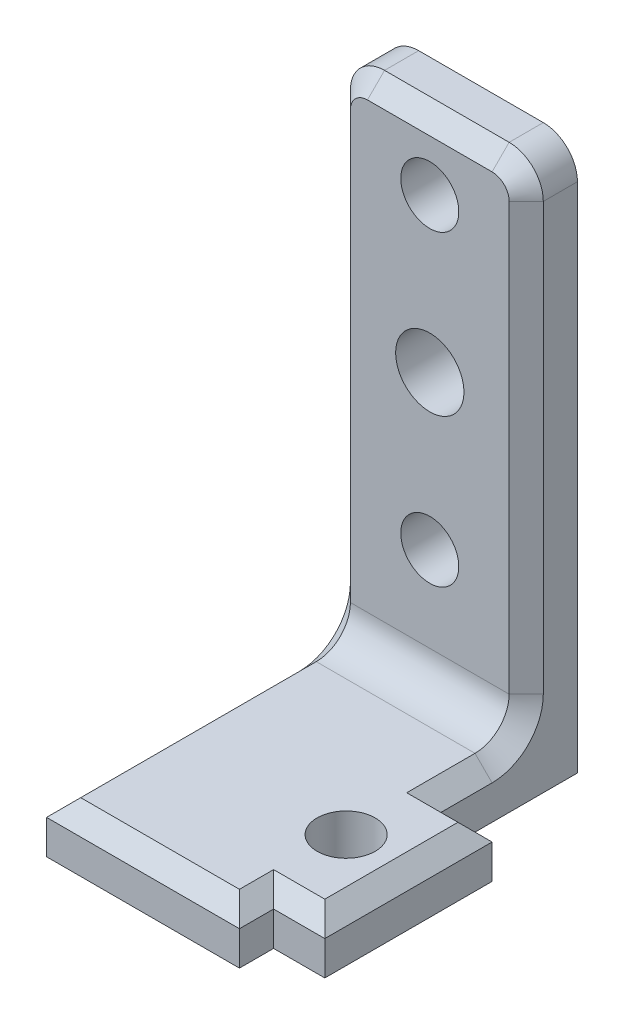
ISO-10303-21;
HEADER;
FILE_DESCRIPTION(('STEP AP214'),'2;1');
FILE_NAME('part.step','',(''),(''),'','','');
FILE_SCHEMA(('AUTOMOTIVE_DESIGN { 1 0 10303 214 1 1 1 1 }'));
ENDSEC;
DATA;
#1=APPLICATION_CONTEXT('core data for automotive mechanical design processes');
#2=APPLICATION_PROTOCOL_DEFINITION('international standard','automotive_design',2000,#1);
#3=PRODUCT_CONTEXT('',#1,'mechanical');
#4=PRODUCT('Part','Part','',(#3));
#5=PRODUCT_RELATED_PRODUCT_CATEGORY('part','',(#4));
#6=PRODUCT_DEFINITION_FORMATION('','',#4);
#7=PRODUCT_DEFINITION_CONTEXT('part definition',#1,'design');
#8=PRODUCT_DEFINITION('design','',#6,#7);
#9=PRODUCT_DEFINITION_SHAPE('','',#8);
#10=(LENGTH_UNIT() NAMED_UNIT(*) SI_UNIT(.MILLI.,.METRE.));
#11=(NAMED_UNIT(*) PLANE_ANGLE_UNIT() SI_UNIT($,.RADIAN.));
#12=(NAMED_UNIT(*) SI_UNIT($,.STERADIAN.) SOLID_ANGLE_UNIT());
#13=UNCERTAINTY_MEASURE_WITH_UNIT(LENGTH_MEASURE(1.E-05),#10,'distance_accuracy_value','');
#14=(GEOMETRIC_REPRESENTATION_CONTEXT(3) GLOBAL_UNCERTAINTY_ASSIGNED_CONTEXT((#13)) GLOBAL_UNIT_ASSIGNED_CONTEXT((#10,
#11,#12)) REPRESENTATION_CONTEXT('',''));
#15=CARTESIAN_POINT('',(0.,0.,0.));
#16=DIRECTION('',(0.,0.,1.));
#17=DIRECTION('',(1.,0.,0.));
#18=AXIS2_PLACEMENT_3D('',#15,#16,#17);
#19=CARTESIAN_POINT('',(0.,3.,-1.89999999999999));
#20=DIRECTION('',(0.,0.,-1.));
#21=DIRECTION('',(-1.,0.,0.));
#22=AXIS2_PLACEMENT_3D('',#19,#20,#21);
#23=PLANE('',#22);
#24=DIRECTION('',(0.,-1.,0.));
#25=VECTOR('',#24,1.);
#26=CARTESIAN_POINT('',(5.65,3.,-1.89999999999999));
#27=LINE('',#26,#25);
#28=CARTESIAN_POINT('',(5.65,2.,-1.89999999999999));
#29=VERTEX_POINT('',#28);
#30=CARTESIAN_POINT('',(5.65,0.,-1.89999999999999));
#31=VERTEX_POINT('',#30);
#32=EDGE_CURVE('E181',#29,#31,#27,.T.);
#33=ORIENTED_EDGE('',*,*,#32,.F.);
#34=DIRECTION('',(1.,0.,0.));
#35=VECTOR('',#34,1.);
#36=CARTESIAN_POINT('',(0.,2.,-1.89999999999999));
#37=LINE('',#36,#35);
#38=CARTESIAN_POINT('',(8.65,2.,-1.89999999999999));
#39=VERTEX_POINT('',#38);
#40=EDGE_CURVE('E352',#29,#39,#37,.T.);
#41=ORIENTED_EDGE('',*,*,#40,.T.);
#42=DIRECTION('',(0.,-1.,0.));
#43=VECTOR('',#42,1.);
#44=CARTESIAN_POINT('',(8.65,3.,-1.89999999999999));
#45=LINE('',#44,#43);
#46=CARTESIAN_POINT('',(8.65,0.,-1.89999999999999));
#47=VERTEX_POINT('',#46);
#48=EDGE_CURVE('E198',#39,#47,#45,.T.);
#49=ORIENTED_EDGE('',*,*,#48,.T.);
#50=DIRECTION('',(1.,0.,0.));
#51=VECTOR('',#50,1.);
#52=CARTESIAN_POINT('',(0.,0.,-1.89999999999999));
#53=LINE('',#52,#51);
#54=EDGE_CURVE('E196',#31,#47,#53,.T.);
#55=ORIENTED_EDGE('',*,*,#54,.F.);
#56=EDGE_LOOP('',(#33,#41,#49,#55));
#57=FACE_BOUND('',#56,.T.);
#58=ADVANCED_FACE('F41',(#57),#23,.T.);
#59=CARTESIAN_POINT('',(5.65,3.,0.));
#60=DIRECTION('',(1.,0.,0.));
#61=DIRECTION('',(0.,0.,-1.));
#62=AXIS2_PLACEMENT_3D('',#59,#60,#61);
#63=PLANE('',#62);
#64=CARTESIAN_POINT('',(5.65,5.,-4.9));
#65=DIRECTION('',(1.,0.,0.));
#66=DIRECTION('',(0.,0.,-1.));
#67=AXIS2_PLACEMENT_3D('',#64,#65,#66);
#68=CIRCLE('',#67,3.);
#69=CARTESIAN_POINT('',(5.65,5.,-7.90000000000001));
#70=VERTEX_POINT('',#69);
#71=CARTESIAN_POINT('',(5.65,2.,-4.9));
#72=VERTEX_POINT('',#71);
#73=EDGE_CURVE('E286',#70,#72,#68,.F.);
#74=ORIENTED_EDGE('',*,*,#73,.T.);
#75=DIRECTION('',(0.,0.,1.));
#76=VECTOR('',#75,1.);
#77=CARTESIAN_POINT('',(5.65,2.,0.));
#78=LINE('',#77,#76);
#79=EDGE_CURVE('E189',#72,#29,#78,.T.);
#80=ORIENTED_EDGE('',*,*,#79,.T.);
#81=ORIENTED_EDGE('',*,*,#32,.T.);
#82=DIRECTION('',(0.,0.,1.));
#83=VECTOR('',#82,1.);
#84=CARTESIAN_POINT('',(5.65,0.,0.));
#85=LINE('',#84,#83);
#86=CARTESIAN_POINT('',(5.65,0.,-9.9));
#87=VERTEX_POINT('',#86);
#88=EDGE_CURVE('E186',#87,#31,#85,.T.);
#89=ORIENTED_EDGE('',*,*,#88,.F.);
#90=DIRECTION('',(0.,-1.,0.));
#91=VECTOR('',#90,1.);
#92=CARTESIAN_POINT('',(5.65,3.,-9.9));
#93=LINE('',#92,#91);
#94=CARTESIAN_POINT('',(5.65,30.,-9.9));
#95=VERTEX_POINT('',#94);
#96=EDGE_CURVE('E193',#95,#87,#93,.T.);
#97=ORIENTED_EDGE('',*,*,#96,.F.);
#98=DIRECTION('',(0.,0.,-1.));
#99=VECTOR('',#98,1.);
#100=CARTESIAN_POINT('',(5.65,30.,0.));
#101=LINE('',#100,#99);
#102=CARTESIAN_POINT('',(5.65,30.,-7.90000000000001));
#103=VERTEX_POINT('',#102);
#104=EDGE_CURVE('E276',#95,#103,#101,.F.);
#105=ORIENTED_EDGE('',*,*,#104,.T.);
#106=DIRECTION('',(0.,-1.,0.));
#107=VECTOR('',#106,1.);
#108=CARTESIAN_POINT('',(5.65,5.00000000000001,-7.90000000000001));
#109=LINE('',#108,#107);
#110=EDGE_CURVE('E283',#103,#70,#109,.T.);
#111=ORIENTED_EDGE('',*,*,#110,.T.);
#112=EDGE_LOOP('',(#74,#80,#81,#89,#97,#105,#111));
#113=FACE_BOUND('',#112,.T.);
#114=ADVANCED_FACE('F183',(#113),#63,.T.);
#115=CARTESIAN_POINT('',(0.,3.,-9.9));
#116=DIRECTION('',(0.,0.,-1.));
#117=DIRECTION('',(-1.,0.,0.));
#118=AXIS2_PLACEMENT_3D('',#115,#116,#117);
#119=PLANE('',#118);
#120=CARTESIAN_POINT('',(0.,10.,-9.9));
#121=DIRECTION('',(0.,0.,-1.));
#122=DIRECTION('',(-1.,0.,0.));
#123=AXIS2_PLACEMENT_3D('',#120,#121,#122);
#124=CIRCLE('',#123,1.7);
#125=CARTESIAN_POINT('',(-1.7,10.,-9.9));
#126=VERTEX_POINT('',#125);
#127=EDGE_CURVE('E518',#126,#126,#124,.T.);
#128=ORIENTED_EDGE('',*,*,#127,.F.);
#129=EDGE_LOOP('',(#128));
#130=FACE_BOUND('',#129,.T.);
#131=CARTESIAN_POINT('',(0.,28.,-9.9));
#132=DIRECTION('',(0.,0.,-1.));
#133=DIRECTION('',(-1.,0.,0.));
#134=AXIS2_PLACEMENT_3D('',#131,#132,#133);
#135=CIRCLE('',#134,1.7);
#136=CARTESIAN_POINT('',(-1.7,28.,-9.9));
#137=VERTEX_POINT('',#136);
#138=EDGE_CURVE('E429',#137,#137,#135,.T.);
#139=ORIENTED_EDGE('',*,*,#138,.F.);
#140=EDGE_LOOP('',(#139));
#141=FACE_BOUND('',#140,.T.);
#142=CARTESIAN_POINT('',(0.,19.,-9.9));
#143=DIRECTION('',(0.,0.,-1.));
#144=DIRECTION('',(-1.,0.,0.));
#145=AXIS2_PLACEMENT_3D('',#142,#143,#144);
#146=CIRCLE('',#145,2.);
#147=CARTESIAN_POINT('',(-2.,19.,-9.9));
#148=VERTEX_POINT('',#147);
#149=EDGE_CURVE('E416',#148,#148,#146,.T.);
#150=ORIENTED_EDGE('',*,*,#149,.F.);
#151=EDGE_LOOP('',(#150));
#152=FACE_BOUND('',#151,.T.);
#153=DIRECTION('',(-1.,0.,0.));
#154=VECTOR('',#153,1.);
#155=CARTESIAN_POINT('',(-5.65,32.,-9.9));
#156=LINE('',#155,#154);
#157=CARTESIAN_POINT('',(3.65,32.,-9.9));
#158=VERTEX_POINT('',#157);
#159=CARTESIAN_POINT('',(-3.65,32.,-9.9));
#160=VERTEX_POINT('',#159);
#161=EDGE_CURVE('E435',#158,#160,#156,.T.);
#162=ORIENTED_EDGE('',*,*,#161,.F.);
#163=CARTESIAN_POINT('',(3.65,30.,-9.9));
#164=DIRECTION('',(0.,0.,-1.));
#165=DIRECTION('',(-1.,0.,0.));
#166=AXIS2_PLACEMENT_3D('',#163,#164,#165);
#167=CIRCLE('',#166,2.);
#168=EDGE_CURVE('E273',#158,#95,#167,.T.);
#169=ORIENTED_EDGE('',*,*,#168,.T.);
#170=ORIENTED_EDGE('',*,*,#96,.T.);
#171=DIRECTION('',(1.,0.,0.));
#172=VECTOR('',#171,1.);
#173=CARTESIAN_POINT('',(0.,0.,-9.9));
#174=LINE('',#173,#172);
#175=CARTESIAN_POINT('',(-5.65,0.,-9.9));
#176=VERTEX_POINT('',#175);
#177=EDGE_CURVE('E208',#176,#87,#174,.T.);
#178=ORIENTED_EDGE('',*,*,#177,.F.);
#179=DIRECTION('',(0.,-1.,0.));
#180=VECTOR('',#179,1.);
#181=CARTESIAN_POINT('',(-5.65,3.,-9.9));
#182=LINE('',#181,#180);
#183=CARTESIAN_POINT('',(-5.65,30.,-9.9));
#184=VERTEX_POINT('',#183);
#185=EDGE_CURVE('E251',#184,#176,#182,.T.);
#186=ORIENTED_EDGE('',*,*,#185,.F.);
#187=CARTESIAN_POINT('',(-3.65,30.,-9.9));
#188=DIRECTION('',(0.,0.,-1.));
#189=DIRECTION('',(-1.,0.,0.));
#190=AXIS2_PLACEMENT_3D('',#187,#188,#189);
#191=CIRCLE('',#190,2.);
#192=EDGE_CURVE('E270',#184,#160,#191,.T.);
#193=ORIENTED_EDGE('',*,*,#192,.T.);
#194=EDGE_LOOP('',(#162,#169,#170,#178,#186,#193));
#195=FACE_BOUND('',#194,.T.);
#196=ADVANCED_FACE('F469',(#130,#141,#152,#195),#119,.T.);
#197=CARTESIAN_POINT('',(-5.65,3.,0.));
#198=DIRECTION('',(1.,0.,0.));
#199=DIRECTION('',(0.,0.,-1.));
#200=AXIS2_PLACEMENT_3D('',#197,#198,#199);
#201=PLANE('',#200);
#202=CARTESIAN_POINT('',(-5.65,5.,-4.9));
#203=DIRECTION('',(1.,0.,0.));
#204=DIRECTION('',(0.,0.,-1.));
#205=AXIS2_PLACEMENT_3D('',#202,#203,#204);
#206=CIRCLE('',#205,3.);
#207=CARTESIAN_POINT('',(-5.65,2.,-4.9));
#208=VERTEX_POINT('',#207);
#209=CARTESIAN_POINT('',(-5.65,5.,-7.90000000000001));
#210=VERTEX_POINT('',#209);
#211=EDGE_CURVE('E346',#208,#210,#206,.T.);
#212=ORIENTED_EDGE('',*,*,#211,.T.);
#213=DIRECTION('',(0.,1.,0.));
#214=VECTOR('',#213,1.);
#215=CARTESIAN_POINT('',(-5.65,3.,-7.90000000000001));
#216=LINE('',#215,#214);
#217=CARTESIAN_POINT('',(-5.65,30.,-7.90000000000001));
#218=VERTEX_POINT('',#217);
#219=EDGE_CURVE('E349',#210,#218,#216,.T.);
#220=ORIENTED_EDGE('',*,*,#219,.T.);
#221=DIRECTION('',(0.,0.,1.));
#222=VECTOR('',#221,1.);
#223=CARTESIAN_POINT('',(-5.65,30.,-9.9));
#224=LINE('',#223,#222);
#225=EDGE_CURVE('E280',#218,#184,#224,.F.);
#226=ORIENTED_EDGE('',*,*,#225,.T.);
#227=ORIENTED_EDGE('',*,*,#185,.T.);
#228=DIRECTION('',(0.,0.,1.));
#229=VECTOR('',#228,1.);
#230=CARTESIAN_POINT('',(-5.65,0.,0.));
#231=LINE('',#230,#229);
#232=CARTESIAN_POINT('',(-5.65,0.,9.9));
#233=VERTEX_POINT('',#232);
#234=EDGE_CURVE('E213',#176,#233,#231,.T.);
#235=ORIENTED_EDGE('',*,*,#234,.T.);
#236=DIRECTION('',(0.,-1.,0.));
#237=VECTOR('',#236,1.);
#238=CARTESIAN_POINT('',(-5.65,3.,9.9));
#239=LINE('',#238,#237);
#240=CARTESIAN_POINT('',(-5.65,2.,9.9));
#241=VERTEX_POINT('',#240);
#242=EDGE_CURVE('E248',#241,#233,#239,.T.);
#243=ORIENTED_EDGE('',*,*,#242,.F.);
#244=DIRECTION('',(0.,0.,-1.));
#245=VECTOR('',#244,1.);
#246=CARTESIAN_POINT('',(-5.65,2.,-4.9));
#247=LINE('',#246,#245);
#248=EDGE_CURVE('E343',#241,#208,#247,.T.);
#249=ORIENTED_EDGE('',*,*,#248,.T.);
#250=EDGE_LOOP('',(#212,#220,#226,#227,#235,#243,#249));
#251=FACE_BOUND('',#250,.T.);
#252=ADVANCED_FACE('F474',(#251),#201,.F.);
#253=CARTESIAN_POINT('',(0.,3.,9.9));
#254=DIRECTION('',(0.,0.,-1.));
#255=DIRECTION('',(-1.,0.,0.));
#256=AXIS2_PLACEMENT_3D('',#253,#254,#255);
#257=PLANE('',#256);
#258=DIRECTION('',(0.,-1.,0.));
#259=VECTOR('',#258,1.);
#260=CARTESIAN_POINT('',(5.65,3.,9.9));
#261=LINE('',#260,#259);
#262=CARTESIAN_POINT('',(5.65,2.,9.9));
#263=VERTEX_POINT('',#262);
#264=CARTESIAN_POINT('',(5.65,0.,9.9));
#265=VERTEX_POINT('',#264);
#266=EDGE_CURVE('E245',#263,#265,#261,.T.);
#267=ORIENTED_EDGE('',*,*,#266,.F.);
#268=DIRECTION('',(-1.,0.,0.));
#269=VECTOR('',#268,1.);
#270=CARTESIAN_POINT('',(-5.65,2.,9.9));
#271=LINE('',#270,#269);
#272=EDGE_CURVE('E11',#263,#241,#271,.T.);
#273=ORIENTED_EDGE('',*,*,#272,.T.);
#274=ORIENTED_EDGE('',*,*,#242,.T.);
#275=DIRECTION('',(1.,0.,0.));
#276=VECTOR('',#275,1.);
#277=CARTESIAN_POINT('',(0.,0.,9.9));
#278=LINE('',#277,#276);
#279=EDGE_CURVE('E218',#233,#265,#278,.T.);
#280=ORIENTED_EDGE('',*,*,#279,.T.);
#281=EDGE_LOOP('',(#267,#273,#274,#280));
#282=FACE_BOUND('',#281,.T.);
#283=ADVANCED_FACE('F478',(#282),#257,.F.);
#284=DIRECTION('',(0.,-1.,0.));
#285=VECTOR('',#284,1.);
#286=CARTESIAN_POINT('',(5.65,3.,7.90000000000001));
#287=LINE('',#286,#285);
#288=CARTESIAN_POINT('',(5.65,2.,7.90000000000001));
#289=VERTEX_POINT('',#288);
#290=CARTESIAN_POINT('',(5.65,0.,7.90000000000001));
#291=VERTEX_POINT('',#290);
#292=EDGE_CURVE('E242',#289,#291,#287,.T.);
#293=ORIENTED_EDGE('',*,*,#292,.F.);
#294=DIRECTION('',(0.,0.,1.));
#295=VECTOR('',#294,1.);
#296=CARTESIAN_POINT('',(5.65,2.,0.));
#297=LINE('',#296,#295);
#298=EDGE_CURVE('E51',#289,#263,#297,.T.);
#299=ORIENTED_EDGE('',*,*,#298,.T.);
#300=ORIENTED_EDGE('',*,*,#266,.T.);
#301=EDGE_CURVE('E211',#291,#265,#85,.T.);
#302=ORIENTED_EDGE('',*,*,#301,.F.);
#303=EDGE_LOOP('',(#293,#299,#300,#302));
#304=FACE_BOUND('',#303,.T.);
#305=ADVANCED_FACE('F461',(#304),#63,.T.);
#306=CARTESIAN_POINT('',(0.,3.,7.90000000000001));
#307=DIRECTION('',(0.,0.,-1.));
#308=DIRECTION('',(-1.,0.,0.));
#309=AXIS2_PLACEMENT_3D('',#306,#307,#308);
#310=PLANE('',#309);
#311=DIRECTION('',(0.,-1.,0.));
#312=VECTOR('',#311,1.);
#313=CARTESIAN_POINT('',(8.65,3.,7.90000000000001));
#314=LINE('',#313,#312);
#315=CARTESIAN_POINT('',(8.65,2.,7.90000000000001));
#316=VERTEX_POINT('',#315);
#317=CARTESIAN_POINT('',(8.65,0.,7.90000000000001));
#318=VERTEX_POINT('',#317);
#319=EDGE_CURVE('E239',#316,#318,#314,.T.);
#320=ORIENTED_EDGE('',*,*,#319,.F.);
#321=DIRECTION('',(-1.,0.,0.));
#322=VECTOR('',#321,1.);
#323=CARTESIAN_POINT('',(5.65,2.,7.90000000000001));
#324=LINE('',#323,#322);
#325=EDGE_CURVE('E66',#316,#289,#324,.T.);
#326=ORIENTED_EDGE('',*,*,#325,.T.);
#327=ORIENTED_EDGE('',*,*,#292,.T.);
#328=DIRECTION('',(1.,0.,0.));
#329=VECTOR('',#328,1.);
#330=CARTESIAN_POINT('',(0.,0.,7.90000000000001));
#331=LINE('',#330,#329);
#332=EDGE_CURVE('E217',#291,#318,#331,.T.);
#333=ORIENTED_EDGE('',*,*,#332,.T.);
#334=EDGE_LOOP('',(#320,#326,#327,#333));
#335=FACE_BOUND('',#334,.T.);
#336=ADVANCED_FACE('F451',(#335),#310,.F.);
#337=CARTESIAN_POINT('',(5.,3.,3.));
#338=DIRECTION('',(0.,-1.,0.));
#339=DIRECTION('',(0.,0.,-1.));
#340=AXIS2_PLACEMENT_3D('',#337,#338,#339);
#341=CYLINDRICAL_SURFACE('',#340,1.7);
#342=CARTESIAN_POINT('',(5.,3.,3.));
#343=DIRECTION('',(0.,1.,0.));
#344=DIRECTION('',(0.,0.,1.));
#345=AXIS2_PLACEMENT_3D('',#342,#343,#344);
#346=CIRCLE('',#345,1.7);
#347=CARTESIAN_POINT('',(5.,3.,4.7));
#348=VERTEX_POINT('',#347);
#349=EDGE_CURVE('E236',#348,#348,#346,.T.);
#350=ORIENTED_EDGE('',*,*,#349,.T.);
#351=EDGE_LOOP('',(#350));
#352=FACE_BOUND('',#351,.T.);
#353=CARTESIAN_POINT('',(5.,0.,3.));
#354=DIRECTION('',(0.,1.,0.));
#355=DIRECTION('',(0.,0.,1.));
#356=AXIS2_PLACEMENT_3D('',#353,#354,#355);
#357=CIRCLE('',#356,1.7);
#358=CARTESIAN_POINT('',(5.,0.,4.7));
#359=VERTEX_POINT('',#358);
#360=EDGE_CURVE('E203',#359,#359,#357,.T.);
#361=ORIENTED_EDGE('',*,*,#360,.F.);
#362=EDGE_LOOP('',(#361));
#363=FACE_BOUND('',#362,.T.);
#364=ADVANCED_FACE('F448',(#352,#363),#341,.F.);
#365=CARTESIAN_POINT('',(8.65,3.,0.));
#366=DIRECTION('',(1.,0.,0.));
#367=DIRECTION('',(0.,0.,-1.));
#368=AXIS2_PLACEMENT_3D('',#365,#366,#367);
#369=PLANE('',#368);
#370=ORIENTED_EDGE('',*,*,#48,.F.);
#371=DIRECTION('',(0.,0.,1.));
#372=VECTOR('',#371,1.);
#373=CARTESIAN_POINT('',(8.65,2.,0.));
#374=LINE('',#373,#372);
#375=EDGE_CURVE('E355',#39,#316,#374,.T.);
#376=ORIENTED_EDGE('',*,*,#375,.T.);
#377=ORIENTED_EDGE('',*,*,#319,.T.);
#378=DIRECTION('',(0.,0.,1.));
#379=VECTOR('',#378,1.);
#380=CARTESIAN_POINT('',(8.65,0.,0.));
#381=LINE('',#380,#379);
#382=EDGE_CURVE('E225',#47,#318,#381,.T.);
#383=ORIENTED_EDGE('',*,*,#382,.F.);
#384=EDGE_LOOP('',(#370,#376,#377,#383));
#385=FACE_BOUND('',#384,.T.);
#386=ADVANCED_FACE('F450',(#385),#369,.T.);
#387=CARTESIAN_POINT('',(0.,3.,0.));
#388=DIRECTION('',(0.,1.,0.));
#389=DIRECTION('',(0.,0.,1.));
#390=AXIS2_PLACEMENT_3D('',#387,#388,#389);
#391=PLANE('',#390);
#392=DIRECTION('',(-1.,0.,0.));
#393=VECTOR('',#392,1.);
#394=CARTESIAN_POINT('',(0.,3.,-0.899999999999994));
#395=LINE('',#394,#393);
#396=CARTESIAN_POINT('',(7.65,3.,-0.899999999999994));
#397=VERTEX_POINT('',#396);
#398=CARTESIAN_POINT('',(4.65,3.,-0.899999999999994));
#399=VERTEX_POINT('',#398);
#400=EDGE_CURVE('E306',#397,#399,#395,.T.);
#401=ORIENTED_EDGE('',*,*,#400,.T.);
#402=DIRECTION('',(0.,0.,-1.));
#403=VECTOR('',#402,1.);
#404=CARTESIAN_POINT('',(4.65,3.,0.));
#405=LINE('',#404,#403);
#406=CARTESIAN_POINT('',(4.65,3.,-4.9));
#407=VERTEX_POINT('',#406);
#408=EDGE_CURVE('E309',#399,#407,#405,.T.);
#409=ORIENTED_EDGE('',*,*,#408,.T.);
#410=DIRECTION('',(1.,0.,0.));
#411=VECTOR('',#410,1.);
#412=CARTESIAN_POINT('',(0.,3.,-4.9));
#413=LINE('',#412,#411);
#414=CARTESIAN_POINT('',(-4.65,3.,-4.9));
#415=VERTEX_POINT('',#414);
#416=EDGE_CURVE('E259',#407,#415,#413,.F.);
#417=ORIENTED_EDGE('',*,*,#416,.T.);
#418=DIRECTION('',(0.,0.,1.));
#419=VECTOR('',#418,1.);
#420=CARTESIAN_POINT('',(-4.65,3.,9.9));
#421=LINE('',#420,#419);
#422=CARTESIAN_POINT('',(-4.65,3.,8.9));
#423=VERTEX_POINT('',#422);
#424=EDGE_CURVE('E291',#415,#423,#421,.T.);
#425=ORIENTED_EDGE('',*,*,#424,.T.);
#426=DIRECTION('',(1.,0.,0.));
#427=VECTOR('',#426,1.);
#428=CARTESIAN_POINT('',(5.65,3.,8.9));
#429=LINE('',#428,#427);
#430=CARTESIAN_POINT('',(4.65,3.,8.9));
#431=VERTEX_POINT('',#430);
#432=EDGE_CURVE('E294',#423,#431,#429,.T.);
#433=ORIENTED_EDGE('',*,*,#432,.T.);
#434=DIRECTION('',(0.,0.,-1.));
#435=VECTOR('',#434,1.);
#436=CARTESIAN_POINT('',(4.65,3.,0.));
#437=LINE('',#436,#435);
#438=CARTESIAN_POINT('',(4.65,3.,6.9));
#439=VERTEX_POINT('',#438);
#440=EDGE_CURVE('E297',#431,#439,#437,.T.);
#441=ORIENTED_EDGE('',*,*,#440,.T.);
#442=DIRECTION('',(1.,0.,0.));
#443=VECTOR('',#442,1.);
#444=CARTESIAN_POINT('',(8.65,3.,6.9));
#445=LINE('',#444,#443);
#446=CARTESIAN_POINT('',(7.65,3.,6.9));
#447=VERTEX_POINT('',#446);
#448=EDGE_CURVE('E300',#439,#447,#445,.T.);
#449=ORIENTED_EDGE('',*,*,#448,.T.);
#450=DIRECTION('',(0.,0.,-1.));
#451=VECTOR('',#450,1.);
#452=CARTESIAN_POINT('',(7.65,3.,0.));
#453=LINE('',#452,#451);
#454=EDGE_CURVE('E303',#447,#397,#453,.T.);
#455=ORIENTED_EDGE('',*,*,#454,.T.);
#456=EDGE_LOOP('',(#401,#409,#417,#425,#433,#441,#449,#455));
#457=FACE_BOUND('',#456,.T.);
#458=ORIENTED_EDGE('',*,*,#349,.F.);
#459=EDGE_LOOP('',(#458));
#460=FACE_BOUND('',#459,.T.);
#461=ADVANCED_FACE('F458',(#457,#460),#391,.T.);
#462=CARTESIAN_POINT('',(0.,0.,0.));
#463=DIRECTION('',(0.,1.,0.));
#464=DIRECTION('',(0.,0.,1.));
#465=AXIS2_PLACEMENT_3D('',#462,#463,#464);
#466=PLANE('',#465);
#467=ORIENTED_EDGE('',*,*,#360,.T.);
#468=EDGE_LOOP('',(#467));
#469=FACE_BOUND('',#468,.T.);
#470=ORIENTED_EDGE('',*,*,#54,.T.);
#471=ORIENTED_EDGE('',*,*,#382,.T.);
#472=ORIENTED_EDGE('',*,*,#332,.F.);
#473=ORIENTED_EDGE('',*,*,#301,.T.);
#474=ORIENTED_EDGE('',*,*,#279,.F.);
#475=ORIENTED_EDGE('',*,*,#234,.F.);
#476=ORIENTED_EDGE('',*,*,#177,.T.);
#477=ORIENTED_EDGE('',*,*,#88,.T.);
#478=EDGE_LOOP('',(#470,#471,#472,#473,#474,#475,#476,#477));
#479=FACE_BOUND('',#478,.T.);
#480=ADVANCED_FACE('F205',(#469,#479),#466,.F.);
#481=CARTESIAN_POINT('',(-5.65,32.,-6.9));
#482=DIRECTION('',(0.,0.,-1.));
#483=DIRECTION('',(-1.,0.,0.));
#484=AXIS2_PLACEMENT_3D('',#481,#482,#483);
#485=PLANE('',#484);
#486=CARTESIAN_POINT('',(0.,10.,-6.9));
#487=DIRECTION('',(0.,0.,-1.));
#488=DIRECTION('',(-1.,0.,0.));
#489=AXIS2_PLACEMENT_3D('',#486,#487,#488);
#490=CIRCLE('',#489,1.7);
#491=CARTESIAN_POINT('',(-1.7,10.,-6.9));
#492=VERTEX_POINT('',#491);
#493=EDGE_CURVE('E439',#492,#492,#490,.F.);
#494=ORIENTED_EDGE('',*,*,#493,.F.);
#495=EDGE_LOOP('',(#494));
#496=FACE_BOUND('',#495,.T.);
#497=CARTESIAN_POINT('',(0.,28.,-6.9));
#498=DIRECTION('',(0.,0.,-1.));
#499=DIRECTION('',(-1.,0.,0.));
#500=AXIS2_PLACEMENT_3D('',#497,#498,#499);
#501=CIRCLE('',#500,1.7);
#502=CARTESIAN_POINT('',(-1.7,28.,-6.9));
#503=VERTEX_POINT('',#502);
#504=EDGE_CURVE('E432',#503,#503,#501,.F.);
#505=ORIENTED_EDGE('',*,*,#504,.F.);
#506=EDGE_LOOP('',(#505));
#507=FACE_BOUND('',#506,.T.);
#508=CARTESIAN_POINT('',(0.,19.,-6.9));
#509=DIRECTION('',(0.,0.,-1.));
#510=DIRECTION('',(-1.,0.,0.));
#511=AXIS2_PLACEMENT_3D('',#508,#509,#510);
#512=CIRCLE('',#511,2.);
#513=CARTESIAN_POINT('',(-2.,19.,-6.9));
#514=VERTEX_POINT('',#513);
#515=EDGE_CURVE('E423',#514,#514,#512,.F.);
#516=ORIENTED_EDGE('',*,*,#515,.F.);
#517=EDGE_LOOP('',(#516));
#518=FACE_BOUND('',#517,.T.);
#519=DIRECTION('',(1.,0.,0.));
#520=VECTOR('',#519,1.);
#521=CARTESIAN_POINT('',(-5.65,5.,-6.9));
#522=LINE('',#521,#520);
#523=CARTESIAN_POINT('',(-4.65,5.,-6.9));
#524=VERTEX_POINT('',#523);
#525=CARTESIAN_POINT('',(4.65,5.,-6.9));
#526=VERTEX_POINT('',#525);
#527=EDGE_CURVE('E192',#524,#526,#522,.T.);
#528=ORIENTED_EDGE('',*,*,#527,.T.);
#529=DIRECTION('',(0.,1.,0.));
#530=VECTOR('',#529,1.);
#531=CARTESIAN_POINT('',(4.65,30.,-6.9));
#532=LINE('',#531,#530);
#533=CARTESIAN_POINT('',(4.65,30.,-6.9));
#534=VERTEX_POINT('',#533);
#535=EDGE_CURVE('E331',#526,#534,#532,.T.);
#536=ORIENTED_EDGE('',*,*,#535,.T.);
#537=CARTESIAN_POINT('',(3.65,30.,-6.9));
#538=DIRECTION('',(0.,0.,-1.));
#539=DIRECTION('',(-1.,0.,0.));
#540=AXIS2_PLACEMENT_3D('',#537,#538,#539);
#541=CIRCLE('',#540,1.);
#542=CARTESIAN_POINT('',(3.65,31.,-6.9));
#543=VERTEX_POINT('',#542);
#544=EDGE_CURVE('E328',#534,#543,#541,.F.);
#545=ORIENTED_EDGE('',*,*,#544,.T.);
#546=DIRECTION('',(-1.,0.,0.));
#547=VECTOR('',#546,1.);
#548=CARTESIAN_POINT('',(-3.65,31.,-6.9));
#549=LINE('',#548,#547);
#550=CARTESIAN_POINT('',(-3.65,31.,-6.9));
#551=VERTEX_POINT('',#550);
#552=EDGE_CURVE('E325',#543,#551,#549,.T.);
#553=ORIENTED_EDGE('',*,*,#552,.T.);
#554=CARTESIAN_POINT('',(-3.65,30.,-6.9));
#555=DIRECTION('',(0.,0.,-1.));
#556=DIRECTION('',(-1.,0.,0.));
#557=AXIS2_PLACEMENT_3D('',#554,#555,#556);
#558=CIRCLE('',#557,1.);
#559=CARTESIAN_POINT('',(-4.65,30.,-6.9));
#560=VERTEX_POINT('',#559);
#561=EDGE_CURVE('E322',#551,#560,#558,.F.);
#562=ORIENTED_EDGE('',*,*,#561,.T.);
#563=DIRECTION('',(0.,-1.,0.));
#564=VECTOR('',#563,1.);
#565=CARTESIAN_POINT('',(-4.65,32.,-6.9));
#566=LINE('',#565,#564);
#567=EDGE_CURVE('E319',#560,#524,#566,.T.);
#568=ORIENTED_EDGE('',*,*,#567,.T.);
#569=EDGE_LOOP('',(#528,#536,#545,#553,#562,#568));
#570=FACE_BOUND('',#569,.T.);
#571=ADVANCED_FACE('F485',(#496,#507,#518,#570),#485,.F.);
#572=CARTESIAN_POINT('',(0.,32.,0.));
#573=DIRECTION('',(0.,1.,0.));
#574=DIRECTION('',(0.,0.,1.));
#575=AXIS2_PLACEMENT_3D('',#572,#573,#574);
#576=PLANE('',#575);
#577=DIRECTION('',(0.,0.,1.));
#578=VECTOR('',#577,1.);
#579=CARTESIAN_POINT('',(-3.65,32.,-6.9));
#580=LINE('',#579,#578);
#581=CARTESIAN_POINT('',(-3.65,32.,-7.90000000000001));
#582=VERTEX_POINT('',#581);
#583=EDGE_CURVE('E263',#160,#582,#580,.T.);
#584=ORIENTED_EDGE('',*,*,#583,.T.);
#585=DIRECTION('',(1.,0.,0.));
#586=VECTOR('',#585,1.);
#587=CARTESIAN_POINT('',(3.65,32.,-7.90000000000001));
#588=LINE('',#587,#586);
#589=CARTESIAN_POINT('',(3.65,32.,-7.90000000000001));
#590=VERTEX_POINT('',#589);
#591=EDGE_CURVE('E337',#582,#590,#588,.T.);
#592=ORIENTED_EDGE('',*,*,#591,.T.);
#593=DIRECTION('',(0.,0.,-1.));
#594=VECTOR('',#593,1.);
#595=CARTESIAN_POINT('',(3.65,32.,0.));
#596=LINE('',#595,#594);
#597=EDGE_CURVE('E267',#590,#158,#596,.T.);
#598=ORIENTED_EDGE('',*,*,#597,.T.);
#599=ORIENTED_EDGE('',*,*,#161,.T.);
#600=EDGE_LOOP('',(#584,#592,#598,#599));
#601=FACE_BOUND('',#600,.T.);
#602=ADVANCED_FACE('F491',(#601),#576,.T.);
#603=CARTESIAN_POINT('',(0.,19.,-1.24314575050762));
#604=DIRECTION('',(0.,0.,-1.));
#605=DIRECTION('',(-1.,0.,0.));
#606=AXIS2_PLACEMENT_3D('',#603,#604,#605);
#607=CYLINDRICAL_SURFACE('',#606,2.);
#608=ORIENTED_EDGE('',*,*,#515,.T.);
#609=EDGE_LOOP('',(#608));
#610=FACE_BOUND('',#609,.T.);
#611=ORIENTED_EDGE('',*,*,#149,.T.);
#612=EDGE_LOOP('',(#611));
#613=FACE_BOUND('',#612,.T.);
#614=ADVANCED_FACE('F495',(#610,#613),#607,.F.);
#615=CARTESIAN_POINT('',(0.,28.,-1.24314575050762));
#616=DIRECTION('',(0.,0.,-1.));
#617=DIRECTION('',(-1.,0.,0.));
#618=AXIS2_PLACEMENT_3D('',#615,#616,#617);
#619=CYLINDRICAL_SURFACE('',#618,1.7);
#620=ORIENTED_EDGE('',*,*,#504,.T.);
#621=EDGE_LOOP('',(#620));
#622=FACE_BOUND('',#621,.T.);
#623=ORIENTED_EDGE('',*,*,#138,.T.);
#624=EDGE_LOOP('',(#623));
#625=FACE_BOUND('',#624,.T.);
#626=ADVANCED_FACE('F499',(#622,#625),#619,.F.);
#627=CARTESIAN_POINT('',(0.,10.,-1.24314575050762));
#628=DIRECTION('',(0.,0.,-1.));
#629=DIRECTION('',(-1.,0.,0.));
#630=AXIS2_PLACEMENT_3D('',#627,#628,#629);
#631=CYLINDRICAL_SURFACE('',#630,1.7);
#632=ORIENTED_EDGE('',*,*,#493,.T.);
#633=EDGE_LOOP('',(#632));
#634=FACE_BOUND('',#633,.T.);
#635=ORIENTED_EDGE('',*,*,#127,.T.);
#636=EDGE_LOOP('',(#635));
#637=FACE_BOUND('',#636,.T.);
#638=ADVANCED_FACE('F503',(#634,#637),#631,.F.);
#639=CARTESIAN_POINT('',(-5.65,5.,-4.9));
#640=DIRECTION('',(1.,0.,0.));
#641=DIRECTION('',(0.,0.,-1.));
#642=AXIS2_PLACEMENT_3D('',#639,#640,#641);
#643=CYLINDRICAL_SURFACE('',#642,2.);
#644=ORIENTED_EDGE('',*,*,#416,.F.);
#645=CARTESIAN_POINT('',(4.65,5.,-4.9));
#646=DIRECTION('',(1.,0.,0.));
#647=DIRECTION('',(0.,0.,-1.));
#648=AXIS2_PLACEMENT_3D('',#645,#646,#647);
#649=CIRCLE('',#648,2.);
#650=EDGE_CURVE('E316',#407,#526,#649,.T.);
#651=ORIENTED_EDGE('',*,*,#650,.T.);
#652=ORIENTED_EDGE('',*,*,#527,.F.);
#653=CARTESIAN_POINT('',(-4.65,5.,-4.9));
#654=DIRECTION('',(1.,0.,0.));
#655=DIRECTION('',(0.,0.,-1.));
#656=AXIS2_PLACEMENT_3D('',#653,#654,#655);
#657=CIRCLE('',#656,2.);
#658=EDGE_CURVE('E313',#524,#415,#657,.F.);
#659=ORIENTED_EDGE('',*,*,#658,.T.);
#660=EDGE_LOOP('',(#644,#651,#652,#659));
#661=FACE_BOUND('',#660,.T.);
#662=ADVANCED_FACE('F506',(#661),#643,.F.);
#663=CARTESIAN_POINT('',(3.65,30.,0.));
#664=DIRECTION('',(0.,0.,-1.));
#665=DIRECTION('',(-1.,0.,0.));
#666=AXIS2_PLACEMENT_3D('',#663,#664,#665);
#667=CYLINDRICAL_SURFACE('',#666,2.);
#668=ORIENTED_EDGE('',*,*,#597,.F.);
#669=CARTESIAN_POINT('',(3.65,30.,-7.90000000000001));
#670=DIRECTION('',(0.,0.,-1.));
#671=DIRECTION('',(-1.,0.,0.));
#672=AXIS2_PLACEMENT_3D('',#669,#670,#671);
#673=CIRCLE('',#672,2.);
#674=EDGE_CURVE('E334',#590,#103,#673,.T.);
#675=ORIENTED_EDGE('',*,*,#674,.T.);
#676=ORIENTED_EDGE('',*,*,#104,.F.);
#677=ORIENTED_EDGE('',*,*,#168,.F.);
#678=EDGE_LOOP('',(#668,#675,#676,#677));
#679=FACE_BOUND('',#678,.T.);
#680=ADVANCED_FACE('F511',(#679),#667,.T.);
#681=CARTESIAN_POINT('',(-3.65,30.,0.));
#682=DIRECTION('',(0.,0.,-1.));
#683=DIRECTION('',(-1.,0.,0.));
#684=AXIS2_PLACEMENT_3D('',#681,#682,#683);
#685=CYLINDRICAL_SURFACE('',#684,2.);
#686=ORIENTED_EDGE('',*,*,#225,.F.);
#687=CARTESIAN_POINT('',(-3.65,30.,-7.90000000000001));
#688=DIRECTION('',(0.,0.,-1.));
#689=DIRECTION('',(-1.,0.,0.));
#690=AXIS2_PLACEMENT_3D('',#687,#688,#689);
#691=CIRCLE('',#690,2.);
#692=EDGE_CURVE('E340',#218,#582,#691,.T.);
#693=ORIENTED_EDGE('',*,*,#692,.T.);
#694=ORIENTED_EDGE('',*,*,#583,.F.);
#695=ORIENTED_EDGE('',*,*,#192,.F.);
#696=EDGE_LOOP('',(#686,#693,#694,#695));
#697=FACE_BOUND('',#696,.T.);
#698=ADVANCED_FACE('F541',(#697),#685,.T.);
#699=CARTESIAN_POINT('',(-5.65,5.,-4.9));
#700=DIRECTION('',(-1.,0.,0.));
#701=DIRECTION('',(0.,0.,1.));
#702=AXIS2_PLACEMENT_3D('',#699,#700,#701);
#703=CONICAL_SURFACE('',#702,3.,0.78539816339745);
#704=DIRECTION('',(-0.707106781186547,-0.707106781186548,0.));
#705=VECTOR('',#704,1.);
#706=CARTESIAN_POINT('',(-4.65,3.,-4.9));
#707=LINE('',#706,#705);
#708=EDGE_CURVE('E407',#415,#208,#707,.T.);
#709=ORIENTED_EDGE('',*,*,#708,.F.);
#710=ORIENTED_EDGE('',*,*,#658,.F.);
#711=DIRECTION('',(0.707106781186547,0.,0.707106781186548));
#712=VECTOR('',#711,1.);
#713=CARTESIAN_POINT('',(-5.65,5.,-7.90000000000001));
#714=LINE('',#713,#712);
#715=EDGE_CURVE('E45',#210,#524,#714,.T.);
#716=ORIENTED_EDGE('',*,*,#715,.F.);
#717=ORIENTED_EDGE('',*,*,#211,.F.);
#718=EDGE_LOOP('',(#709,#710,#716,#717));
#719=FACE_BOUND('',#718,.T.);
#720=ADVANCED_FACE('F43',(#719),#703,.F.);
#721=CARTESIAN_POINT('',(-4.65,32.,-6.9));
#722=DIRECTION('',(0.707106781186549,0.,-0.707106781186547));
#723=DIRECTION('',(0.,-1.,0.));
#724=AXIS2_PLACEMENT_3D('',#721,#722,#723);
#725=PLANE('',#724);
#726=ORIENTED_EDGE('',*,*,#715,.T.);
#727=ORIENTED_EDGE('',*,*,#567,.F.);
#728=DIRECTION('',(0.707106781186547,0.,0.707106781186549));
#729=VECTOR('',#728,1.);
#730=CARTESIAN_POINT('',(-5.65,30.,-7.90000000000001));
#731=LINE('',#730,#729);
#732=EDGE_CURVE('E404',#218,#560,#731,.T.);
#733=ORIENTED_EDGE('',*,*,#732,.F.);
#734=ORIENTED_EDGE('',*,*,#219,.F.);
#735=EDGE_LOOP('',(#726,#727,#733,#734));
#736=FACE_BOUND('',#735,.T.);
#737=ADVANCED_FACE('F603',(#736),#725,.F.);
#738=CARTESIAN_POINT('',(-4.65,3.,0.));
#739=DIRECTION('',(-0.707106781186548,0.707106781186547,0.));
#740=DIRECTION('',(0.,0.,-1.));
#741=AXIS2_PLACEMENT_3D('',#738,#739,#740);
#742=PLANE('',#741);
#743=ORIENTED_EDGE('',*,*,#708,.T.);
#744=ORIENTED_EDGE('',*,*,#248,.F.);
#745=DIRECTION('',(0.577350269189625,0.577350269189627,-0.577350269189625));
#746=VECTOR('',#745,1.);
#747=CARTESIAN_POINT('',(-1.68333333333334,5.96666666666667,5.93333333333334));
#748=LINE('',#747,#746);
#749=EDGE_CURVE('E400',#423,#241,#748,.F.);
#750=ORIENTED_EDGE('',*,*,#749,.F.);
#751=ORIENTED_EDGE('',*,*,#424,.F.);
#752=EDGE_LOOP('',(#743,#744,#750,#751));
#753=FACE_BOUND('',#752,.T.);
#754=ADVANCED_FACE('F598',(#753),#742,.T.);
#755=CARTESIAN_POINT('',(-3.65,30.,-6.9));
#756=DIRECTION('',(0.,0.,-1.));
#757=DIRECTION('',(-1.,0.,0.));
#758=AXIS2_PLACEMENT_3D('',#755,#756,#757);
#759=CONICAL_SURFACE('',#758,0.999999999999999,0.785398163397447);
#760=ORIENTED_EDGE('',*,*,#732,.T.);
#761=ORIENTED_EDGE('',*,*,#561,.F.);
#762=DIRECTION('',(0.,-0.707106781186547,0.707106781186549));
#763=VECTOR('',#762,1.);
#764=CARTESIAN_POINT('',(-3.65,32.,-7.90000000000001));
#765=LINE('',#764,#763);
#766=EDGE_CURVE('E396',#582,#551,#765,.T.);
#767=ORIENTED_EDGE('',*,*,#766,.F.);
#768=ORIENTED_EDGE('',*,*,#692,.F.);
#769=EDGE_LOOP('',(#760,#761,#767,#768));
#770=FACE_BOUND('',#769,.T.);
#771=ADVANCED_FACE('F545',(#770),#759,.T.);
#772=CARTESIAN_POINT('',(0.,3.,8.9));
#773=DIRECTION('',(0.,0.707106781186546,0.707106781186549));
#774=DIRECTION('',(-1.,0.,0.));
#775=AXIS2_PLACEMENT_3D('',#772,#773,#774);
#776=PLANE('',#775);
#777=ORIENTED_EDGE('',*,*,#749,.T.);
#778=ORIENTED_EDGE('',*,*,#272,.F.);
#779=DIRECTION('',(0.577350269189625,-0.577350269189627,0.577350269189625));
#780=VECTOR('',#779,1.);
#781=CARTESIAN_POINT('',(3.1,4.55,7.35));
#782=LINE('',#781,#780);
#783=EDGE_CURVE('E392',#431,#263,#782,.T.);
#784=ORIENTED_EDGE('',*,*,#783,.F.);
#785=ORIENTED_EDGE('',*,*,#432,.F.);
#786=EDGE_LOOP('',(#777,#778,#784,#785));
#787=FACE_BOUND('',#786,.T.);
#788=ADVANCED_FACE('F594',(#787),#776,.T.);
#789=CARTESIAN_POINT('',(0.,32.,-7.90000000000001));
#790=DIRECTION('',(0.,0.707106781186549,0.707106781186547));
#791=DIRECTION('',(-1.,0.,0.));
#792=AXIS2_PLACEMENT_3D('',#789,#790,#791);
#793=PLANE('',#792);
#794=ORIENTED_EDGE('',*,*,#766,.T.);
#795=ORIENTED_EDGE('',*,*,#552,.F.);
#796=DIRECTION('',(0.,-0.707106781186547,0.707106781186549));
#797=VECTOR('',#796,1.);
#798=CARTESIAN_POINT('',(3.65,32.,-7.90000000000001));
#799=LINE('',#798,#797);
#800=EDGE_CURVE('E388',#590,#543,#799,.T.);
#801=ORIENTED_EDGE('',*,*,#800,.F.);
#802=ORIENTED_EDGE('',*,*,#591,.F.);
#803=EDGE_LOOP('',(#794,#795,#801,#802));
#804=FACE_BOUND('',#803,.T.);
#805=ADVANCED_FACE('F551',(#804),#793,.T.);
#806=CARTESIAN_POINT('',(5.65,2.,0.));
#807=DIRECTION('',(-0.707106781186549,-0.707106781186546,0.));
#808=DIRECTION('',(0.,0.,1.));
#809=AXIS2_PLACEMENT_3D('',#806,#807,#808);
#810=PLANE('',#809);
#811=ORIENTED_EDGE('',*,*,#783,.T.);
#812=ORIENTED_EDGE('',*,*,#298,.F.);
#813=DIRECTION('',(0.577350269189625,-0.577350269189627,0.577350269189625));
#814=VECTOR('',#813,1.);
#815=CARTESIAN_POINT('',(3.1,4.55,5.35000000000001));
#816=LINE('',#815,#814);
#817=EDGE_CURVE('E384',#439,#289,#816,.T.);
#818=ORIENTED_EDGE('',*,*,#817,.F.);
#819=ORIENTED_EDGE('',*,*,#440,.F.);
#820=EDGE_LOOP('',(#811,#812,#818,#819));
#821=FACE_BOUND('',#820,.T.);
#822=ADVANCED_FACE('F589',(#821),#810,.F.);
#823=CARTESIAN_POINT('',(3.65,30.,-6.9));
#824=DIRECTION('',(0.,0.,-1.));
#825=DIRECTION('',(-1.,0.,0.));
#826=AXIS2_PLACEMENT_3D('',#823,#824,#825);
#827=CONICAL_SURFACE('',#826,1.,0.785398163397446);
#828=ORIENTED_EDGE('',*,*,#800,.T.);
#829=ORIENTED_EDGE('',*,*,#544,.F.);
#830=DIRECTION('',(-0.707106781186546,0.,0.707106781186549));
#831=VECTOR('',#830,1.);
#832=CARTESIAN_POINT('',(5.65,30.,-7.90000000000001));
#833=LINE('',#832,#831);
#834=EDGE_CURVE('E380',#103,#534,#833,.T.);
#835=ORIENTED_EDGE('',*,*,#834,.F.);
#836=ORIENTED_EDGE('',*,*,#674,.F.);
#837=EDGE_LOOP('',(#828,#829,#835,#836));
#838=FACE_BOUND('',#837,.T.);
#839=ADVANCED_FACE('F560',(#838),#827,.T.);
#840=CARTESIAN_POINT('',(0.,3.,6.9));
#841=DIRECTION('',(0.,0.707106781186546,0.707106781186549));
#842=DIRECTION('',(-1.,0.,0.));
#843=AXIS2_PLACEMENT_3D('',#840,#841,#842);
#844=PLANE('',#843);
#845=ORIENTED_EDGE('',*,*,#817,.T.);
#846=ORIENTED_EDGE('',*,*,#325,.F.);
#847=DIRECTION('',(0.577350269189625,-0.577350269189627,0.577350269189625));
#848=VECTOR('',#847,1.);
#849=CARTESIAN_POINT('',(5.1,5.55,4.35000000000001));
#850=LINE('',#849,#848);
#851=EDGE_CURVE('E376',#447,#316,#850,.T.);
#852=ORIENTED_EDGE('',*,*,#851,.F.);
#853=ORIENTED_EDGE('',*,*,#448,.F.);
#854=EDGE_LOOP('',(#845,#846,#852,#853));
#855=FACE_BOUND('',#854,.T.);
#856=ADVANCED_FACE('F585',(#855),#844,.T.);
#857=CARTESIAN_POINT('',(5.65,3.,-7.90000000000001));
#858=DIRECTION('',(0.707106781186548,0.,0.707106781186547));
#859=DIRECTION('',(0.,1.,0.));
#860=AXIS2_PLACEMENT_3D('',#857,#858,#859);
#861=PLANE('',#860);
#862=ORIENTED_EDGE('',*,*,#834,.T.);
#863=ORIENTED_EDGE('',*,*,#535,.F.);
#864=DIRECTION('',(-0.707106781186547,0.,0.707106781186548));
#865=VECTOR('',#864,1.);
#866=CARTESIAN_POINT('',(5.65,5.,-7.90000000000001));
#867=LINE('',#866,#865);
#868=EDGE_CURVE('E372',#70,#526,#867,.T.);
#869=ORIENTED_EDGE('',*,*,#868,.F.);
#870=ORIENTED_EDGE('',*,*,#110,.F.);
#871=EDGE_LOOP('',(#862,#863,#869,#870));
#872=FACE_BOUND('',#871,.T.);
#873=ADVANCED_FACE('F563',(#872),#861,.T.);
#874=CARTESIAN_POINT('',(8.65,2.,0.));
#875=DIRECTION('',(-0.707106781186549,-0.707106781186546,0.));
#876=DIRECTION('',(0.,0.,1.));
#877=AXIS2_PLACEMENT_3D('',#874,#875,#876);
#878=PLANE('',#877);
#879=ORIENTED_EDGE('',*,*,#851,.T.);
#880=ORIENTED_EDGE('',*,*,#375,.F.);
#881=DIRECTION('',(-0.577350269189625,0.577350269189627,0.577350269189625));
#882=VECTOR('',#881,1.);
#883=CARTESIAN_POINT('',(8.01666666666667,2.63333333333333,-1.26666666666667));
#884=LINE('',#883,#882);
#885=EDGE_CURVE('E368',#397,#39,#884,.F.);
#886=ORIENTED_EDGE('',*,*,#885,.F.);
#887=ORIENTED_EDGE('',*,*,#454,.F.);
#888=EDGE_LOOP('',(#879,#880,#886,#887));
#889=FACE_BOUND('',#888,.T.);
#890=ADVANCED_FACE('F580',(#889),#878,.F.);
#891=CARTESIAN_POINT('',(5.65,5.,-4.9));
#892=DIRECTION('',(1.,0.,0.));
#893=DIRECTION('',(0.,0.,-1.));
#894=AXIS2_PLACEMENT_3D('',#891,#892,#893);
#895=CONICAL_SURFACE('',#894,3.,0.78539816339745);
#896=ORIENTED_EDGE('',*,*,#868,.T.);
#897=ORIENTED_EDGE('',*,*,#650,.F.);
#898=DIRECTION('',(-0.707106781186546,0.707106781186549,0.));
#899=VECTOR('',#898,1.);
#900=CARTESIAN_POINT('',(5.65,2.,-4.9));
#901=LINE('',#900,#899);
#902=EDGE_CURVE('E365',#72,#407,#901,.T.);
#903=ORIENTED_EDGE('',*,*,#902,.F.);
#904=ORIENTED_EDGE('',*,*,#73,.F.);
#905=EDGE_LOOP('',(#896,#897,#903,#904));
#906=FACE_BOUND('',#905,.T.);
#907=ADVANCED_FACE('F568',(#906),#895,.F.);
#908=CARTESIAN_POINT('',(0.,2.,-1.89999999999999));
#909=DIRECTION('',(0.,-0.707106781186546,0.707106781186549));
#910=DIRECTION('',(1.,0.,0.));
#911=AXIS2_PLACEMENT_3D('',#908,#909,#910);
#912=PLANE('',#911);
#913=ORIENTED_EDGE('',*,*,#885,.T.);
#914=ORIENTED_EDGE('',*,*,#40,.F.);
#915=DIRECTION('',(-0.577350269189625,0.577350269189627,0.577350269189625));
#916=VECTOR('',#915,1.);
#917=CARTESIAN_POINT('',(5.01666666666667,2.63333333333333,-1.26666666666666));
#918=LINE('',#917,#916);
#919=EDGE_CURVE('E362',#399,#29,#918,.F.);
#920=ORIENTED_EDGE('',*,*,#919,.F.);
#921=ORIENTED_EDGE('',*,*,#400,.F.);
#922=EDGE_LOOP('',(#913,#914,#920,#921));
#923=FACE_BOUND('',#922,.T.);
#924=ADVANCED_FACE('F576',(#923),#912,.F.);
#925=CARTESIAN_POINT('',(5.65,2.,0.));
#926=DIRECTION('',(-0.707106781186549,-0.707106781186546,0.));
#927=DIRECTION('',(0.,0.,1.));
#928=AXIS2_PLACEMENT_3D('',#925,#926,#927);
#929=PLANE('',#928);
#930=ORIENTED_EDGE('',*,*,#902,.T.);
#931=ORIENTED_EDGE('',*,*,#408,.F.);
#932=ORIENTED_EDGE('',*,*,#919,.T.);
#933=ORIENTED_EDGE('',*,*,#79,.F.);
#934=EDGE_LOOP('',(#930,#931,#932,#933));
#935=FACE_BOUND('',#934,.T.);
#936=ADVANCED_FACE('F571',(#935),#929,.F.);
#937=CLOSED_SHELL('',(#58,#114,#196,#252,#283,#305,#336,#364,#386,#461,#480,#571,#602,#614,#626,
#638,#662,#680,#698,#720,#737,#754,#771,#788,#805,#822,#839,#856,#873,#890,#907,#924,#936));
#938=MANIFOLD_SOLID_BREP('B2',#937);
#939=ADVANCED_BREP_SHAPE_REPRESENTATION('',(#18,#938),#14);
#940=SHAPE_DEFINITION_REPRESENTATION(#9,#939);
ENDSEC;
END-ISO-10303-21;
